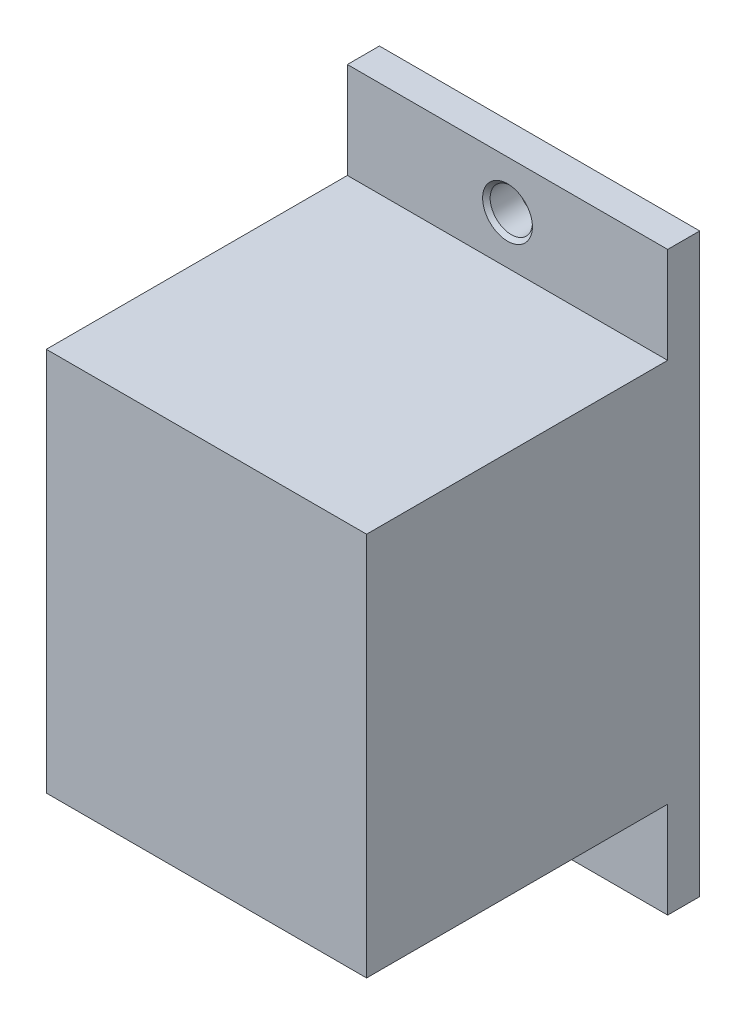
ISO-10303-21;
HEADER;
FILE_DESCRIPTION(('STEP AP214'),'2;1');
FILE_NAME('part.step','',(''),(''),'','','');
FILE_SCHEMA(('AUTOMOTIVE_DESIGN { 1 0 10303 214 1 1 1 1 }'));
ENDSEC;
DATA;
#1=APPLICATION_CONTEXT('core data for automotive mechanical design processes');
#2=APPLICATION_PROTOCOL_DEFINITION('international standard','automotive_design',2000,#1);
#3=PRODUCT_CONTEXT('',#1,'mechanical');
#4=PRODUCT('Part','Part','',(#3));
#5=PRODUCT_RELATED_PRODUCT_CATEGORY('part','',(#4));
#6=PRODUCT_DEFINITION_FORMATION('','',#4);
#7=PRODUCT_DEFINITION_CONTEXT('part definition',#1,'design');
#8=PRODUCT_DEFINITION('design','',#6,#7);
#9=PRODUCT_DEFINITION_SHAPE('','',#8);
#10=(LENGTH_UNIT() NAMED_UNIT(*) SI_UNIT(.MILLI.,.METRE.));
#11=(NAMED_UNIT(*) PLANE_ANGLE_UNIT() SI_UNIT($,.RADIAN.));
#12=(NAMED_UNIT(*) SI_UNIT($,.STERADIAN.) SOLID_ANGLE_UNIT());
#13=UNCERTAINTY_MEASURE_WITH_UNIT(LENGTH_MEASURE(1.E-05),#10,'distance_accuracy_value','');
#14=(GEOMETRIC_REPRESENTATION_CONTEXT(3) GLOBAL_UNCERTAINTY_ASSIGNED_CONTEXT((#13)) GLOBAL_UNIT_ASSIGNED_CONTEXT((#10,
#11,#12)) REPRESENTATION_CONTEXT('',''));
#15=CARTESIAN_POINT('',(0.,0.,0.));
#16=DIRECTION('',(0.,0.,1.));
#17=DIRECTION('',(1.,0.,0.));
#18=AXIS2_PLACEMENT_3D('',#15,#16,#17);
#19=CARTESIAN_POINT('',(0.,30.,50.));
#20=DIRECTION('',(0.,-1.,0.));
#21=DIRECTION('',(1.,0.,0.));
#22=AXIS2_PLACEMENT_3D('',#19,#20,#21);
#23=PLANE('',#22);
#24=DIRECTION('',(1.,0.,0.));
#25=VECTOR('',#24,1.);
#26=CARTESIAN_POINT('',(-25.,30.,5.));
#27=LINE('',#26,#25);
#28=CARTESIAN_POINT('',(-25.,30.,5.));
#29=VERTEX_POINT('',#28);
#30=CARTESIAN_POINT('',(25.,30.,5.));
#31=VERTEX_POINT('',#30);
#32=EDGE_CURVE('E58',#29,#31,#27,.T.);
#33=ORIENTED_EDGE('',*,*,#32,.F.);
#34=DIRECTION('',(0.,0.,-1.));
#35=VECTOR('',#34,1.);
#36=CARTESIAN_POINT('',(-25.,30.,50.));
#37=LINE('',#36,#35);
#38=CARTESIAN_POINT('',(-25.,30.,52.));
#39=VERTEX_POINT('',#38);
#40=EDGE_CURVE('E148',#39,#29,#37,.T.);
#41=ORIENTED_EDGE('',*,*,#40,.F.);
#42=DIRECTION('',(-1.,0.,0.));
#43=VECTOR('',#42,1.);
#44=CARTESIAN_POINT('',(-25.,30.,52.));
#45=LINE('',#44,#43);
#46=CARTESIAN_POINT('',(25.,30.,52.));
#47=VERTEX_POINT('',#46);
#48=EDGE_CURVE('E161',#47,#39,#45,.T.);
#49=ORIENTED_EDGE('',*,*,#48,.F.);
#50=DIRECTION('',(0.,0.,-1.));
#51=VECTOR('',#50,1.);
#52=CARTESIAN_POINT('',(25.,30.,50.));
#53=LINE('',#52,#51);
#54=EDGE_CURVE('E213',#47,#31,#53,.T.);
#55=ORIENTED_EDGE('',*,*,#54,.T.);
#56=EDGE_LOOP('',(#33,#41,#49,#55));
#57=FACE_BOUND('',#56,.T.);
#58=ADVANCED_FACE('F44',(#57),#23,.F.);
#59=CARTESIAN_POINT('',(25.,-30.,5.));
#60=DIRECTION('',(1.,0.,0.));
#61=DIRECTION('',(0.,1.,0.));
#62=AXIS2_PLACEMENT_3D('',#59,#60,#61);
#63=PLANE('',#62);
#64=DIRECTION('',(0.,-1.,0.));
#65=VECTOR('',#64,1.);
#66=CARTESIAN_POINT('',(25.,-30.,0.));
#67=LINE('',#66,#65);
#68=CARTESIAN_POINT('',(25.,45.,0.));
#69=VERTEX_POINT('',#68);
#70=CARTESIAN_POINT('',(25.,-45.,0.));
#71=VERTEX_POINT('',#70);
#72=EDGE_CURVE('E214',#69,#71,#67,.T.);
#73=ORIENTED_EDGE('',*,*,#72,.F.);
#74=DIRECTION('',(0.,0.,-1.));
#75=VECTOR('',#74,1.);
#76=CARTESIAN_POINT('',(25.,45.,5.));
#77=LINE('',#76,#75);
#78=CARTESIAN_POINT('',(25.,45.,5.));
#79=VERTEX_POINT('',#78);
#80=EDGE_CURVE('E171',#79,#69,#77,.T.);
#81=ORIENTED_EDGE('',*,*,#80,.F.);
#82=DIRECTION('',(0.,1.,0.));
#83=VECTOR('',#82,1.);
#84=CARTESIAN_POINT('',(25.,30.,5.));
#85=LINE('',#84,#83);
#86=EDGE_CURVE('E177',#31,#79,#85,.T.);
#87=ORIENTED_EDGE('',*,*,#86,.F.);
#88=ORIENTED_EDGE('',*,*,#54,.F.);
#89=DIRECTION('',(0.,1.,0.));
#90=VECTOR('',#89,1.);
#91=CARTESIAN_POINT('',(25.,30.,52.));
#92=LINE('',#91,#90);
#93=CARTESIAN_POINT('',(25.,-30.,52.));
#94=VERTEX_POINT('',#93);
#95=EDGE_CURVE('E156',#94,#47,#92,.T.);
#96=ORIENTED_EDGE('',*,*,#95,.F.);
#97=DIRECTION('',(0.,0.,-1.));
#98=VECTOR('',#97,1.);
#99=CARTESIAN_POINT('',(25.,-30.,50.));
#100=LINE('',#99,#98);
#101=CARTESIAN_POINT('',(25.,-30.,5.));
#102=VERTEX_POINT('',#101);
#103=EDGE_CURVE('E150',#94,#102,#100,.T.);
#104=ORIENTED_EDGE('',*,*,#103,.T.);
#105=DIRECTION('',(0.,-1.,0.));
#106=VECTOR('',#105,1.);
#107=CARTESIAN_POINT('',(25.,-30.,5.));
#108=LINE('',#107,#106);
#109=CARTESIAN_POINT('',(25.,-45.,5.));
#110=VERTEX_POINT('',#109);
#111=EDGE_CURVE('E224',#102,#110,#108,.T.);
#112=ORIENTED_EDGE('',*,*,#111,.T.);
#113=DIRECTION('',(0.,0.,-1.));
#114=VECTOR('',#113,1.);
#115=CARTESIAN_POINT('',(25.,-45.,5.));
#116=LINE('',#115,#114);
#117=EDGE_CURVE('E47',#110,#71,#116,.T.);
#118=ORIENTED_EDGE('',*,*,#117,.T.);
#119=EDGE_LOOP('',(#73,#81,#87,#88,#96,#104,#112,#118));
#120=FACE_BOUND('',#119,.T.);
#121=ADVANCED_FACE('F50',(#120),#63,.T.);
#122=CARTESIAN_POINT('',(-25.,-30.,5.));
#123=DIRECTION('',(1.,0.,0.));
#124=DIRECTION('',(0.,0.,-1.));
#125=AXIS2_PLACEMENT_3D('',#122,#123,#124);
#126=PLANE('',#125);
#127=DIRECTION('',(0.,-1.,0.));
#128=VECTOR('',#127,1.);
#129=CARTESIAN_POINT('',(-25.,-30.,0.));
#130=LINE('',#129,#128);
#131=CARTESIAN_POINT('',(-25.,45.,0.));
#132=VERTEX_POINT('',#131);
#133=CARTESIAN_POINT('',(-25.,-45.,0.));
#134=VERTEX_POINT('',#133);
#135=EDGE_CURVE('E81',#132,#134,#130,.T.);
#136=ORIENTED_EDGE('',*,*,#135,.T.);
#137=DIRECTION('',(0.,0.,-1.));
#138=VECTOR('',#137,1.);
#139=CARTESIAN_POINT('',(-25.,-45.,5.));
#140=LINE('',#139,#138);
#141=CARTESIAN_POINT('',(-25.,-45.,5.));
#142=VERTEX_POINT('',#141);
#143=EDGE_CURVE('E11',#142,#134,#140,.T.);
#144=ORIENTED_EDGE('',*,*,#143,.F.);
#145=DIRECTION('',(0.,-1.,0.));
#146=VECTOR('',#145,1.);
#147=CARTESIAN_POINT('',(-25.,-30.,5.));
#148=LINE('',#147,#146);
#149=CARTESIAN_POINT('',(-25.,-30.,5.));
#150=VERTEX_POINT('',#149);
#151=EDGE_CURVE('E68',#150,#142,#148,.T.);
#152=ORIENTED_EDGE('',*,*,#151,.F.);
#153=DIRECTION('',(0.,0.,-1.));
#154=VECTOR('',#153,1.);
#155=CARTESIAN_POINT('',(-25.,-30.,50.));
#156=LINE('',#155,#154);
#157=CARTESIAN_POINT('',(-25.,-30.,52.));
#158=VERTEX_POINT('',#157);
#159=EDGE_CURVE('E138',#158,#150,#156,.T.);
#160=ORIENTED_EDGE('',*,*,#159,.F.);
#161=DIRECTION('',(0.,-1.,0.));
#162=VECTOR('',#161,1.);
#163=CARTESIAN_POINT('',(-25.,30.,52.));
#164=LINE('',#163,#162);
#165=EDGE_CURVE('E141',#39,#158,#164,.T.);
#166=ORIENTED_EDGE('',*,*,#165,.F.);
#167=ORIENTED_EDGE('',*,*,#40,.T.);
#168=DIRECTION('',(0.,1.,0.));
#169=VECTOR('',#168,1.);
#170=CARTESIAN_POINT('',(-25.,30.,5.));
#171=LINE('',#170,#169);
#172=CARTESIAN_POINT('',(-25.,45.,5.));
#173=VERTEX_POINT('',#172);
#174=EDGE_CURVE('E185',#29,#173,#171,.T.);
#175=ORIENTED_EDGE('',*,*,#174,.T.);
#176=DIRECTION('',(0.,0.,-1.));
#177=VECTOR('',#176,1.);
#178=CARTESIAN_POINT('',(-25.,45.,5.));
#179=LINE('',#178,#177);
#180=EDGE_CURVE('E173',#173,#132,#179,.T.);
#181=ORIENTED_EDGE('',*,*,#180,.T.);
#182=EDGE_LOOP('',(#136,#144,#152,#160,#166,#167,#175,#181));
#183=FACE_BOUND('',#182,.T.);
#184=ADVANCED_FACE('F143',(#183),#126,.F.);
#185=CARTESIAN_POINT('',(-25.,-45.,5.));
#186=DIRECTION('',(0.,1.,0.));
#187=DIRECTION('',(0.,0.,1.));
#188=AXIS2_PLACEMENT_3D('',#185,#186,#187);
#189=PLANE('',#188);
#190=DIRECTION('',(1.,0.,0.));
#191=VECTOR('',#190,1.);
#192=CARTESIAN_POINT('',(-25.,-45.,0.));
#193=LINE('',#192,#191);
#194=EDGE_CURVE('E231',#134,#71,#193,.T.);
#195=ORIENTED_EDGE('',*,*,#194,.T.);
#196=ORIENTED_EDGE('',*,*,#117,.F.);
#197=DIRECTION('',(1.,0.,0.));
#198=VECTOR('',#197,1.);
#199=CARTESIAN_POINT('',(-25.,-45.,5.));
#200=LINE('',#199,#198);
#201=EDGE_CURVE('E87',#142,#110,#200,.T.);
#202=ORIENTED_EDGE('',*,*,#201,.F.);
#203=ORIENTED_EDGE('',*,*,#143,.T.);
#204=EDGE_LOOP('',(#195,#196,#202,#203));
#205=FACE_BOUND('',#204,.T.);
#206=ADVANCED_FACE('F240',(#205),#189,.F.);
#207=CARTESIAN_POINT('',(0.,0.,5.));
#208=DIRECTION('',(0.,0.,1.));
#209=DIRECTION('',(1.,0.,0.));
#210=AXIS2_PLACEMENT_3D('',#207,#208,#209);
#211=PLANE('',#210);
#212=CARTESIAN_POINT('',(0.,-37.5,5.));
#213=DIRECTION('',(0.,0.,1.));
#214=DIRECTION('',(1.,0.,0.));
#215=AXIS2_PLACEMENT_3D('',#212,#213,#214);
#216=CIRCLE('',#215,3.8865);
#217=CARTESIAN_POINT('',(3.8865,-37.5,5.));
#218=VERTEX_POINT('',#217);
#219=EDGE_CURVE('E483',#218,#218,#216,.T.);
#220=ORIENTED_EDGE('',*,*,#219,.F.);
#221=EDGE_LOOP('',(#220));
#222=FACE_BOUND('',#221,.T.);
#223=ORIENTED_EDGE('',*,*,#111,.F.);
#224=DIRECTION('',(1.,0.,0.));
#225=VECTOR('',#224,1.);
#226=CARTESIAN_POINT('',(-25.,-30.,5.));
#227=LINE('',#226,#225);
#228=EDGE_CURVE('E227',#150,#102,#227,.T.);
#229=ORIENTED_EDGE('',*,*,#228,.F.);
#230=ORIENTED_EDGE('',*,*,#151,.T.);
#231=ORIENTED_EDGE('',*,*,#201,.T.);
#232=EDGE_LOOP('',(#223,#229,#230,#231));
#233=FACE_BOUND('',#232,.T.);
#234=ADVANCED_FACE('F253',(#222,#233),#211,.T.);
#235=CARTESIAN_POINT('',(0.,0.,0.));
#236=DIRECTION('',(0.,0.,1.));
#237=DIRECTION('',(1.,0.,0.));
#238=AXIS2_PLACEMENT_3D('',#235,#236,#237);
#239=PLANE('',#238);
#240=CARTESIAN_POINT('',(0.,-37.5,0.));
#241=DIRECTION('',(0.,0.,1.));
#242=DIRECTION('',(1.,0.,0.));
#243=AXIS2_PLACEMENT_3D('',#240,#241,#242);
#244=CIRCLE('',#243,3.3);
#245=CARTESIAN_POINT('',(3.3,-37.5,0.));
#246=VERTEX_POINT('',#245);
#247=EDGE_CURVE('E484',#246,#246,#244,.T.);
#248=ORIENTED_EDGE('',*,*,#247,.T.);
#249=EDGE_LOOP('',(#248));
#250=FACE_BOUND('',#249,.T.);
#251=CARTESIAN_POINT('',(0.,37.5,0.));
#252=DIRECTION('',(0.,0.,1.));
#253=DIRECTION('',(1.,0.,0.));
#254=AXIS2_PLACEMENT_3D('',#251,#252,#253);
#255=CIRCLE('',#254,3.3);
#256=CARTESIAN_POINT('',(3.30000000000001,37.5,0.));
#257=VERTEX_POINT('',#256);
#258=EDGE_CURVE('E165',#257,#257,#255,.T.);
#259=ORIENTED_EDGE('',*,*,#258,.T.);
#260=EDGE_LOOP('',(#259));
#261=FACE_BOUND('',#260,.T.);
#262=ORIENTED_EDGE('',*,*,#72,.T.);
#263=ORIENTED_EDGE('',*,*,#194,.F.);
#264=ORIENTED_EDGE('',*,*,#135,.F.);
#265=DIRECTION('',(1.,0.,0.));
#266=VECTOR('',#265,1.);
#267=CARTESIAN_POINT('',(-25.,45.,0.));
#268=LINE('',#267,#266);
#269=EDGE_CURVE('E179',#132,#69,#268,.T.);
#270=ORIENTED_EDGE('',*,*,#269,.T.);
#271=EDGE_LOOP('',(#262,#263,#264,#270));
#272=FACE_BOUND('',#271,.T.);
#273=DIRECTION('',(0.,1.,0.));
#274=VECTOR('',#273,1.);
#275=CARTESIAN_POINT('',(23.,0.,0.));
#276=LINE('',#275,#274);
#277=CARTESIAN_POINT('',(23.,-28.,0.));
#278=VERTEX_POINT('',#277);
#279=CARTESIAN_POINT('',(23.,28.,0.));
#280=VERTEX_POINT('',#279);
#281=EDGE_CURVE('E178',#278,#280,#276,.T.);
#282=ORIENTED_EDGE('',*,*,#281,.T.);
#283=DIRECTION('',(-1.,0.,0.));
#284=VECTOR('',#283,1.);
#285=CARTESIAN_POINT('',(0.,28.,0.));
#286=LINE('',#285,#284);
#287=CARTESIAN_POINT('',(-23.,28.,0.));
#288=VERTEX_POINT('',#287);
#289=EDGE_CURVE('E195',#280,#288,#286,.T.);
#290=ORIENTED_EDGE('',*,*,#289,.T.);
#291=DIRECTION('',(0.,1.,0.));
#292=VECTOR('',#291,1.);
#293=CARTESIAN_POINT('',(-23.,0.,0.));
#294=LINE('',#293,#292);
#295=CARTESIAN_POINT('',(-23.,-28.,0.));
#296=VERTEX_POINT('',#295);
#297=EDGE_CURVE('E202',#296,#288,#294,.T.);
#298=ORIENTED_EDGE('',*,*,#297,.F.);
#299=DIRECTION('',(-1.,0.,0.));
#300=VECTOR('',#299,1.);
#301=CARTESIAN_POINT('',(0.,-28.,0.));
#302=LINE('',#301,#300);
#303=EDGE_CURVE('E201',#278,#296,#302,.T.);
#304=ORIENTED_EDGE('',*,*,#303,.F.);
#305=EDGE_LOOP('',(#282,#290,#298,#304));
#306=FACE_BOUND('',#305,.T.);
#307=ADVANCED_FACE('F239',(#250,#261,#272,#306),#239,.F.);
#308=CARTESIAN_POINT('',(23.,0.,50.));
#309=DIRECTION('',(-1.,0.,0.));
#310=DIRECTION('',(0.,0.,1.));
#311=AXIS2_PLACEMENT_3D('',#308,#309,#310);
#312=PLANE('',#311);
#313=ORIENTED_EDGE('',*,*,#281,.F.);
#314=DIRECTION('',(0.,0.,-1.));
#315=VECTOR('',#314,1.);
#316=CARTESIAN_POINT('',(23.,-28.,50.));
#317=LINE('',#316,#315);
#318=CARTESIAN_POINT('',(23.,-28.,50.));
#319=VERTEX_POINT('',#318);
#320=EDGE_CURVE('E209',#319,#278,#317,.T.);
#321=ORIENTED_EDGE('',*,*,#320,.F.);
#322=DIRECTION('',(0.,1.,0.));
#323=VECTOR('',#322,1.);
#324=CARTESIAN_POINT('',(23.,0.,50.));
#325=LINE('',#324,#323);
#326=CARTESIAN_POINT('',(23.,28.,50.));
#327=VERTEX_POINT('',#326);
#328=EDGE_CURVE('E188',#319,#327,#325,.T.);
#329=ORIENTED_EDGE('',*,*,#328,.T.);
#330=DIRECTION('',(0.,0.,-1.));
#331=VECTOR('',#330,1.);
#332=CARTESIAN_POINT('',(23.,28.,50.));
#333=LINE('',#332,#331);
#334=EDGE_CURVE('E199',#327,#280,#333,.T.);
#335=ORIENTED_EDGE('',*,*,#334,.T.);
#336=EDGE_LOOP('',(#313,#321,#329,#335));
#337=FACE_BOUND('',#336,.T.);
#338=ADVANCED_FACE('F259',(#337),#312,.T.);
#339=CARTESIAN_POINT('',(0.,-28.,50.));
#340=DIRECTION('',(0.,-1.,0.));
#341=DIRECTION('',(0.,0.,-1.));
#342=AXIS2_PLACEMENT_3D('',#339,#340,#341);
#343=PLANE('',#342);
#344=ORIENTED_EDGE('',*,*,#303,.T.);
#345=DIRECTION('',(0.,0.,-1.));
#346=VECTOR('',#345,1.);
#347=CARTESIAN_POINT('',(-23.,-28.,50.));
#348=LINE('',#347,#346);
#349=CARTESIAN_POINT('',(-23.,-28.,50.));
#350=VERTEX_POINT('',#349);
#351=EDGE_CURVE('E218',#350,#296,#348,.T.);
#352=ORIENTED_EDGE('',*,*,#351,.F.);
#353=DIRECTION('',(-1.,0.,0.));
#354=VECTOR('',#353,1.);
#355=CARTESIAN_POINT('',(0.,-28.,50.));
#356=LINE('',#355,#354);
#357=EDGE_CURVE('E191',#319,#350,#356,.T.);
#358=ORIENTED_EDGE('',*,*,#357,.F.);
#359=ORIENTED_EDGE('',*,*,#320,.T.);
#360=EDGE_LOOP('',(#344,#352,#358,#359));
#361=FACE_BOUND('',#360,.T.);
#362=ADVANCED_FACE('F281',(#361),#343,.F.);
#363=CARTESIAN_POINT('',(-23.,0.,50.));
#364=DIRECTION('',(-1.,0.,0.));
#365=DIRECTION('',(0.,-1.,0.));
#366=AXIS2_PLACEMENT_3D('',#363,#364,#365);
#367=PLANE('',#366);
#368=ORIENTED_EDGE('',*,*,#297,.T.);
#369=DIRECTION('',(0.,0.,-1.));
#370=VECTOR('',#369,1.);
#371=CARTESIAN_POINT('',(-23.,28.,50.));
#372=LINE('',#371,#370);
#373=CARTESIAN_POINT('',(-23.,28.,50.));
#374=VERTEX_POINT('',#373);
#375=EDGE_CURVE('E220',#374,#288,#372,.T.);
#376=ORIENTED_EDGE('',*,*,#375,.F.);
#377=DIRECTION('',(0.,1.,0.));
#378=VECTOR('',#377,1.);
#379=CARTESIAN_POINT('',(-23.,0.,50.));
#380=LINE('',#379,#378);
#381=EDGE_CURVE('E192',#350,#374,#380,.T.);
#382=ORIENTED_EDGE('',*,*,#381,.F.);
#383=ORIENTED_EDGE('',*,*,#351,.T.);
#384=EDGE_LOOP('',(#368,#376,#382,#383));
#385=FACE_BOUND('',#384,.T.);
#386=ADVANCED_FACE('F280',(#385),#367,.F.);
#387=CARTESIAN_POINT('',(0.,28.,50.));
#388=DIRECTION('',(0.,-1.,0.));
#389=DIRECTION('',(1.,0.,0.));
#390=AXIS2_PLACEMENT_3D('',#387,#388,#389);
#391=PLANE('',#390);
#392=ORIENTED_EDGE('',*,*,#289,.F.);
#393=ORIENTED_EDGE('',*,*,#334,.F.);
#394=DIRECTION('',(-1.,0.,0.));
#395=VECTOR('',#394,1.);
#396=CARTESIAN_POINT('',(0.,28.,50.));
#397=LINE('',#396,#395);
#398=EDGE_CURVE('E197',#327,#374,#397,.T.);
#399=ORIENTED_EDGE('',*,*,#398,.T.);
#400=ORIENTED_EDGE('',*,*,#375,.T.);
#401=EDGE_LOOP('',(#392,#393,#399,#400));
#402=FACE_BOUND('',#401,.T.);
#403=ADVANCED_FACE('F273',(#402),#391,.T.);
#404=CARTESIAN_POINT('',(0.,-30.,50.));
#405=DIRECTION('',(0.,-1.,0.));
#406=DIRECTION('',(1.,0.,0.));
#407=AXIS2_PLACEMENT_3D('',#404,#405,#406);
#408=PLANE('',#407);
#409=ORIENTED_EDGE('',*,*,#159,.T.);
#410=ORIENTED_EDGE('',*,*,#228,.T.);
#411=ORIENTED_EDGE('',*,*,#103,.F.);
#412=DIRECTION('',(1.,0.,0.));
#413=VECTOR('',#412,1.);
#414=CARTESIAN_POINT('',(-25.,-30.,52.));
#415=LINE('',#414,#413);
#416=EDGE_CURVE('E147',#158,#94,#415,.T.);
#417=ORIENTED_EDGE('',*,*,#416,.F.);
#418=EDGE_LOOP('',(#409,#410,#411,#417));
#419=FACE_BOUND('',#418,.T.);
#420=ADVANCED_FACE('F151',(#419),#408,.T.);
#421=CARTESIAN_POINT('',(-25.,45.,5.));
#422=DIRECTION('',(0.,1.,0.));
#423=DIRECTION('',(0.,0.,1.));
#424=AXIS2_PLACEMENT_3D('',#421,#422,#423);
#425=PLANE('',#424);
#426=ORIENTED_EDGE('',*,*,#269,.F.);
#427=ORIENTED_EDGE('',*,*,#180,.F.);
#428=DIRECTION('',(1.,0.,0.));
#429=VECTOR('',#428,1.);
#430=CARTESIAN_POINT('',(-25.,45.,5.));
#431=LINE('',#430,#429);
#432=EDGE_CURVE('E183',#173,#79,#431,.T.);
#433=ORIENTED_EDGE('',*,*,#432,.T.);
#434=ORIENTED_EDGE('',*,*,#80,.T.);
#435=EDGE_LOOP('',(#426,#427,#433,#434));
#436=FACE_BOUND('',#435,.T.);
#437=ADVANCED_FACE('F249',(#436),#425,.T.);
#438=CARTESIAN_POINT('',(0.,0.,5.));
#439=DIRECTION('',(0.,0.,-1.));
#440=DIRECTION('',(-1.,0.,0.));
#441=AXIS2_PLACEMENT_3D('',#438,#439,#440);
#442=PLANE('',#441);
#443=CARTESIAN_POINT('',(0.,37.5,5.));
#444=DIRECTION('',(0.,0.,1.));
#445=DIRECTION('',(1.,0.,0.));
#446=AXIS2_PLACEMENT_3D('',#443,#444,#445);
#447=CIRCLE('',#446,3.8865);
#448=CARTESIAN_POINT('',(3.88650000000001,37.5,5.));
#449=VERTEX_POINT('',#448);
#450=EDGE_CURVE('E489',#449,#449,#447,.T.);
#451=ORIENTED_EDGE('',*,*,#450,.F.);
#452=EDGE_LOOP('',(#451));
#453=FACE_BOUND('',#452,.T.);
#454=ORIENTED_EDGE('',*,*,#86,.T.);
#455=ORIENTED_EDGE('',*,*,#432,.F.);
#456=ORIENTED_EDGE('',*,*,#174,.F.);
#457=ORIENTED_EDGE('',*,*,#32,.T.);
#458=EDGE_LOOP('',(#454,#455,#456,#457));
#459=FACE_BOUND('',#458,.T.);
#460=ADVANCED_FACE('F247',(#453,#459),#442,.F.);
#461=CARTESIAN_POINT('',(0.,0.,50.));
#462=DIRECTION('',(0.,0.,1.));
#463=DIRECTION('',(1.,0.,0.));
#464=AXIS2_PLACEMENT_3D('',#461,#462,#463);
#465=PLANE('',#464);
#466=ORIENTED_EDGE('',*,*,#328,.F.);
#467=ORIENTED_EDGE('',*,*,#357,.T.);
#468=ORIENTED_EDGE('',*,*,#381,.T.);
#469=ORIENTED_EDGE('',*,*,#398,.F.);
#470=EDGE_LOOP('',(#466,#467,#468,#469));
#471=FACE_BOUND('',#470,.T.);
#472=ADVANCED_FACE('F304',(#471),#465,.F.);
#473=CARTESIAN_POINT('',(0.,0.,52.));
#474=DIRECTION('',(0.,0.,1.));
#475=DIRECTION('',(1.,0.,0.));
#476=AXIS2_PLACEMENT_3D('',#473,#474,#475);
#477=PLANE('',#476);
#478=ORIENTED_EDGE('',*,*,#165,.T.);
#479=ORIENTED_EDGE('',*,*,#416,.T.);
#480=ORIENTED_EDGE('',*,*,#95,.T.);
#481=ORIENTED_EDGE('',*,*,#48,.T.);
#482=EDGE_LOOP('',(#478,#479,#480,#481));
#483=FACE_BOUND('',#482,.T.);
#484=ADVANCED_FACE('F157',(#483),#477,.T.);
#485=CARTESIAN_POINT('',(0.,37.5,5.));
#486=DIRECTION('',(0.,0.,1.));
#487=DIRECTION('',(1.,0.,0.));
#488=AXIS2_PLACEMENT_3D('',#485,#486,#487);
#489=CYLINDRICAL_SURFACE('',#488,3.3);
#490=ORIENTED_EDGE('',*,*,#258,.F.);
#491=EDGE_LOOP('',(#490));
#492=FACE_BOUND('',#491,.T.);
#493=CARTESIAN_POINT('',(0.,37.5,4.4135));
#494=DIRECTION('',(0.,0.,1.));
#495=DIRECTION('',(1.,0.,0.));
#496=AXIS2_PLACEMENT_3D('',#493,#494,#495);
#497=CIRCLE('',#496,3.3);
#498=CARTESIAN_POINT('',(3.30000000000001,37.5,4.4135));
#499=VERTEX_POINT('',#498);
#500=EDGE_CURVE('E164',#499,#499,#497,.T.);
#501=ORIENTED_EDGE('',*,*,#500,.T.);
#502=EDGE_LOOP('',(#501));
#503=FACE_BOUND('',#502,.T.);
#504=ADVANCED_FACE('F307',(#492,#503),#489,.F.);
#505=CARTESIAN_POINT('',(0.,37.5,5.));
#506=DIRECTION('',(0.,0.,1.));
#507=DIRECTION('',(1.,0.,0.));
#508=AXIS2_PLACEMENT_3D('',#505,#506,#507);
#509=CONICAL_SURFACE('',#508,3.8865,0.785398163397448);
#510=ORIENTED_EDGE('',*,*,#500,.F.);
#511=EDGE_LOOP('',(#510));
#512=FACE_BOUND('',#511,.T.);
#513=ORIENTED_EDGE('',*,*,#450,.T.);
#514=EDGE_LOOP('',(#513));
#515=FACE_BOUND('',#514,.T.);
#516=ADVANCED_FACE('F402',(#512,#515),#509,.F.);
#517=CARTESIAN_POINT('',(0.,-37.5,5.));
#518=DIRECTION('',(0.,0.,1.));
#519=DIRECTION('',(1.,0.,0.));
#520=AXIS2_PLACEMENT_3D('',#517,#518,#519);
#521=CYLINDRICAL_SURFACE('',#520,3.3);
#522=ORIENTED_EDGE('',*,*,#247,.F.);
#523=EDGE_LOOP('',(#522));
#524=FACE_BOUND('',#523,.T.);
#525=CARTESIAN_POINT('',(0.,-37.5,4.4135));
#526=DIRECTION('',(0.,0.,1.));
#527=DIRECTION('',(1.,0.,0.));
#528=AXIS2_PLACEMENT_3D('',#525,#526,#527);
#529=CIRCLE('',#528,3.3);
#530=CARTESIAN_POINT('',(3.3,-37.5,4.4135));
#531=VERTEX_POINT('',#530);
#532=EDGE_CURVE('E481',#531,#531,#529,.T.);
#533=ORIENTED_EDGE('',*,*,#532,.T.);
#534=EDGE_LOOP('',(#533));
#535=FACE_BOUND('',#534,.T.);
#536=ADVANCED_FACE('F409',(#524,#535),#521,.F.);
#537=CARTESIAN_POINT('',(0.,-37.5,5.));
#538=DIRECTION('',(0.,0.,1.));
#539=DIRECTION('',(1.,0.,0.));
#540=AXIS2_PLACEMENT_3D('',#537,#538,#539);
#541=CONICAL_SURFACE('',#540,3.8865,0.785398163397448);
#542=ORIENTED_EDGE('',*,*,#532,.F.);
#543=EDGE_LOOP('',(#542));
#544=FACE_BOUND('',#543,.T.);
#545=ORIENTED_EDGE('',*,*,#219,.T.);
#546=EDGE_LOOP('',(#545));
#547=FACE_BOUND('',#546,.T.);
#548=ADVANCED_FACE('F419',(#544,#547),#541,.F.);
#549=CLOSED_SHELL('',(#58,#121,#184,#206,#234,#307,#338,#362,#386,#403,#420,#437,#460,#472,#484,
#504,#516,#536,#548));
#550=MANIFOLD_SOLID_BREP('B2',#549);
#551=ADVANCED_BREP_SHAPE_REPRESENTATION('',(#18,#550),#14);
#552=SHAPE_DEFINITION_REPRESENTATION(#9,#551);
ENDSEC;
END-ISO-10303-21;
